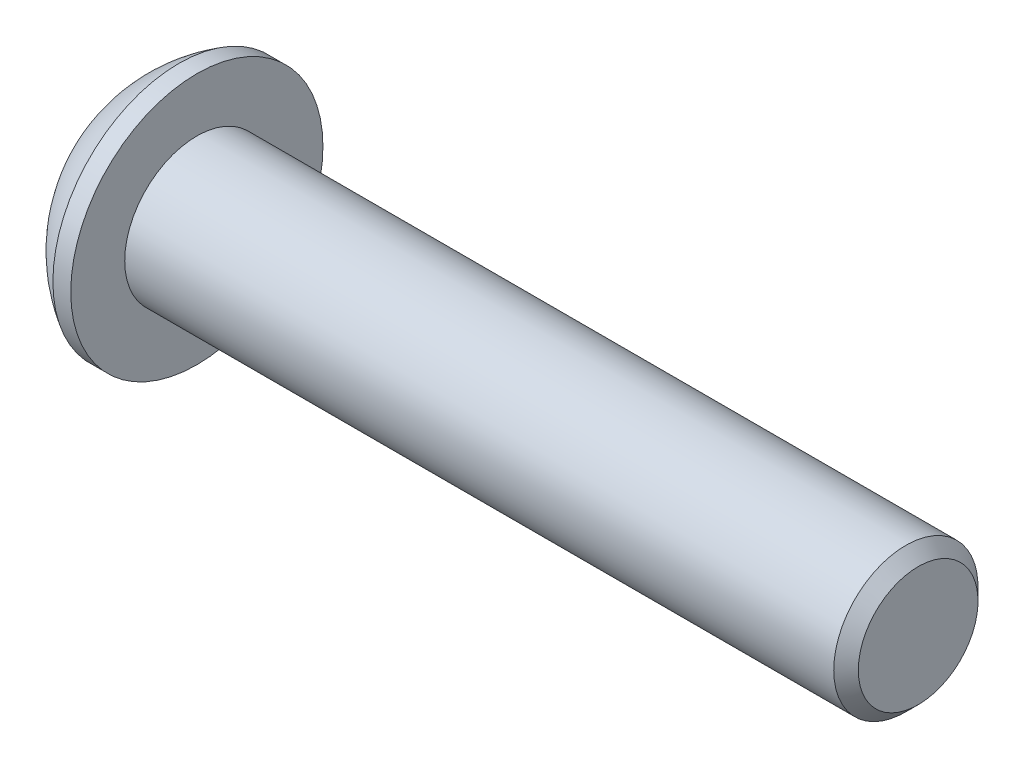
ISO-10303-21;
HEADER;
FILE_DESCRIPTION(('STEP AP214'),'2;1');
FILE_NAME('part.step','',(''),(''),'','','');
FILE_SCHEMA(('AUTOMOTIVE_DESIGN { 1 0 10303 214 1 1 1 1 }'));
ENDSEC;
DATA;
#1=APPLICATION_CONTEXT('core data for automotive mechanical design processes');
#2=APPLICATION_PROTOCOL_DEFINITION('international standard','automotive_design',2000,#1);
#3=PRODUCT_CONTEXT('',#1,'mechanical');
#4=PRODUCT('Part','Part','',(#3));
#5=PRODUCT_RELATED_PRODUCT_CATEGORY('part','',(#4));
#6=PRODUCT_DEFINITION_FORMATION('','',#4);
#7=PRODUCT_DEFINITION_CONTEXT('part definition',#1,'design');
#8=PRODUCT_DEFINITION('design','',#6,#7);
#9=PRODUCT_DEFINITION_SHAPE('','',#8);
#10=(LENGTH_UNIT() NAMED_UNIT(*) SI_UNIT(.MILLI.,.METRE.));
#11=(NAMED_UNIT(*) PLANE_ANGLE_UNIT() SI_UNIT($,.RADIAN.));
#12=(NAMED_UNIT(*) SI_UNIT($,.STERADIAN.) SOLID_ANGLE_UNIT());
#13=UNCERTAINTY_MEASURE_WITH_UNIT(LENGTH_MEASURE(1.E-05),#10,'distance_accuracy_value','');
#14=(GEOMETRIC_REPRESENTATION_CONTEXT(3) GLOBAL_UNCERTAINTY_ASSIGNED_CONTEXT((#13)) GLOBAL_UNIT_ASSIGNED_CONTEXT((#10,
#11,#12)) REPRESENTATION_CONTEXT('',''));
#15=CARTESIAN_POINT('',(0.,0.,0.));
#16=DIRECTION('',(0.,0.,1.));
#17=DIRECTION('',(1.,0.,0.));
#18=AXIS2_PLACEMENT_3D('',#15,#16,#17);
#19=CARTESIAN_POINT('',(0.,0.,0.));
#20=DIRECTION('',(-1.,0.,0.));
#21=DIRECTION('',(0.,0.,1.));
#22=AXIS2_PLACEMENT_3D('',#19,#20,#21);
#23=PLANE('',#22);
#24=CARTESIAN_POINT('',(0.,0.,0.));
#25=DIRECTION('',(-1.,0.,0.));
#26=DIRECTION('',(0.,0.,1.));
#27=AXIS2_PLACEMENT_3D('',#24,#25,#26);
#28=CIRCLE('',#27,2.77495);
#29=CARTESIAN_POINT('',(0.,2.77495,0.));
#30=VERTEX_POINT('',#29);
#31=EDGE_CURVE('E11',#30,#30,#28,.T.);
#32=ORIENTED_EDGE('',*,*,#31,.T.);
#33=EDGE_LOOP('',(#32));
#34=FACE_BOUND('',#33,.T.);
#35=DIRECTION('',(0.,-1.,0.));
#36=VECTOR('',#35,1.);
#37=CARTESIAN_POINT('',(0.,-1.14384635331849,1.9812));
#38=LINE('',#37,#36);
#39=CARTESIAN_POINT('',(0.,1.14384635331849,1.9812));
#40=VERTEX_POINT('',#39);
#41=CARTESIAN_POINT('',(0.,-1.14384635331849,1.9812));
#42=VERTEX_POINT('',#41);
#43=EDGE_CURVE('E46',#40,#42,#38,.T.);
#44=ORIENTED_EDGE('',*,*,#43,.T.);
#45=DIRECTION('',(0.,-0.5,-0.866025403784439));
#46=VECTOR('',#45,1.);
#47=CARTESIAN_POINT('',(0.,-2.28769270663697,0.));
#48=LINE('',#47,#46);
#49=CARTESIAN_POINT('',(0.,-2.28769270663697,0.));
#50=VERTEX_POINT('',#49);
#51=EDGE_CURVE('E362',#42,#50,#48,.T.);
#52=ORIENTED_EDGE('',*,*,#51,.T.);
#53=DIRECTION('',(0.,0.5,-0.866025403784439));
#54=VECTOR('',#53,1.);
#55=CARTESIAN_POINT('',(0.,-1.14384635331849,-1.9812));
#56=LINE('',#55,#54);
#57=CARTESIAN_POINT('',(0.,-1.14384635331849,-1.9812));
#58=VERTEX_POINT('',#57);
#59=EDGE_CURVE('E126',#50,#58,#56,.T.);
#60=ORIENTED_EDGE('',*,*,#59,.T.);
#61=DIRECTION('',(0.,1.,0.));
#62=VECTOR('',#61,1.);
#63=CARTESIAN_POINT('',(0.,1.14384635331849,-1.9812));
#64=LINE('',#63,#62);
#65=CARTESIAN_POINT('',(0.,1.14384635331849,-1.9812));
#66=VERTEX_POINT('',#65);
#67=EDGE_CURVE('E365',#58,#66,#64,.T.);
#68=ORIENTED_EDGE('',*,*,#67,.T.);
#69=DIRECTION('',(0.,0.5,0.866025403784439));
#70=VECTOR('',#69,1.);
#71=CARTESIAN_POINT('',(0.,2.28769270663697,0.));
#72=LINE('',#71,#70);
#73=CARTESIAN_POINT('',(0.,2.28769270663697,0.));
#74=VERTEX_POINT('',#73);
#75=EDGE_CURVE('E367',#66,#74,#72,.T.);
#76=ORIENTED_EDGE('',*,*,#75,.T.);
#77=DIRECTION('',(0.,-0.5,0.866025403784439));
#78=VECTOR('',#77,1.);
#79=CARTESIAN_POINT('',(0.,1.14384635331849,1.9812));
#80=LINE('',#79,#78);
#81=EDGE_CURVE('E369',#74,#40,#80,.T.);
#82=ORIENTED_EDGE('',*,*,#81,.T.);
#83=EDGE_LOOP('',(#44,#52,#60,#68,#76,#82));
#84=FACE_BOUND('',#83,.T.);
#85=ADVANCED_FACE('F32',(#34,#84),#23,.T.);
#86=CARTESIAN_POINT('',(5.78512506188119,0.,0.));
#87=DIRECTION('',(-1.,0.,0.));
#88=DIRECTION('',(0.,1.,0.));
#89=AXIS2_PLACEMENT_3D('',#86,#87,#88);
#90=SPHERICAL_SURFACE('',#89,6.41623094067739);
#91=CARTESIAN_POINT('',(2.5654,0.,0.));
#92=DIRECTION('',(-1.,0.,0.));
#93=DIRECTION('',(0.,0.,1.));
#94=AXIS2_PLACEMENT_3D('',#91,#92,#93);
#95=CIRCLE('',#94,5.5499);
#96=CARTESIAN_POINT('',(2.5654,5.5499,0.));
#97=VERTEX_POINT('',#96);
#98=EDGE_CURVE('E39',#97,#97,#95,.T.);
#99=CARTESIAN_POINT('',(2.5654,5.5499,0.));
#100=CARTESIAN_POINT('',(2.53083708566419,5.52984868712258,0.));
#101=CARTESIAN_POINT('',(2.49646152825914,5.50947442663449,0.));
#102=CARTESIAN_POINT('',(2.42809701945272,5.4680872977392,0.));
#103=CARTESIAN_POINT('',(2.39410806805135,5.447074429332,0.));
#104=CARTESIAN_POINT('',(2.32652866339446,5.40441737190071,0.));
#105=CARTESIAN_POINT('',(2.29293821013895,5.38277318287661,0.));
#106=CARTESIAN_POINT('',(2.22616751866502,5.33886105159856,0.));
#107=CARTESIAN_POINT('',(2.19298728044662,5.3165931093446,0.));
#108=CARTESIAN_POINT('',(2.12704860244366,5.27144124070729,0.));
#109=CARTESIAN_POINT('',(2.09429016265912,5.24855731432393,0.));
#110=CARTESIAN_POINT('',(2.02920651509859,5.20218146582175,0.));
#111=CARTESIAN_POINT('',(1.99688130732261,5.17868954370292,0.));
#112=CARTESIAN_POINT('',(1.93267540683267,5.13110590319174,0.));
#113=CARTESIAN_POINT('',(1.90079471411871,5.10701418479938,0.));
#114=CARTESIAN_POINT('',(1.83748897146475,5.05823936086598,0.));
#115=CARTESIAN_POINT('',(1.80606392152475,5.03355625532495,0.));
#116=CARTESIAN_POINT('',(1.74368043314138,4.98360727255644,0.));
#117=CARTESIAN_POINT('',(1.71272199469802,4.95834139532897,0.));
#118=CARTESIAN_POINT('',(1.65128253514951,4.90723568808467,0.));
#119=CARTESIAN_POINT('',(1.62080151404435,4.88139585806785,0.));
#120=CARTESIAN_POINT('',(1.56032752837792,4.82915126447052,0.));
#121=CARTESIAN_POINT('',(1.53033456381665,4.80274650089003,0.));
#122=CARTESIAN_POINT('',(1.4708471600897,4.74938125657909,0.));
#123=CARTESIAN_POINT('',(1.44135272092403,4.72242077584864,0.));
#124=CARTESIAN_POINT('',(1.38287266283316,4.66795350762059,0.));
#125=CARTESIAN_POINT('',(1.35388704390797,4.64044672012299,0.));
#126=CARTESIAN_POINT('',(1.29643474354244,4.58489643942841,0.));
#127=CARTESIAN_POINT('',(1.26796806210209,4.55685294623144,0.));
#128=CARTESIAN_POINT('',(1.21156357281885,4.50023904253955,0.));
#129=CARTESIAN_POINT('',(1.18362576497595,4.47166863204464,0.));
#130=CARTESIAN_POINT('',(1.12828877440023,4.41401086607543,0.));
#131=CARTESIAN_POINT('',(1.10088959166741,4.38492351060113,0.));
#132=CARTESIAN_POINT('',(1.04663941482087,4.32624200742801,0.));
#133=CARTESIAN_POINT('',(1.01978842070714,4.2966478597292,0.));
#134=CARTESIAN_POINT('',(0.966643993266069,4.2369631017545,0.));
#135=CARTESIAN_POINT('',(0.94035055993872,4.20687249147862,0.));
#136=CARTESIAN_POINT('',(0.888330431624668,4.14620531128432,0.));
#137=CARTESIAN_POINT('',(0.862603736637966,4.11562874136591,0.));
#138=CARTESIAN_POINT('',(0.811726064743087,4.05400031444217,0.));
#139=CARTESIAN_POINT('',(0.786575087834911,4.02294845743684,0.));
#140=CARTESIAN_POINT('',(0.736857630884291,3.96038029479081,0.));
#141=CARTESIAN_POINT('',(0.712291150841848,3.9288639891501,0.));
#142=CARTESIAN_POINT('',(0.6637512623949,3.8653779297977,0.));
#143=CARTESIAN_POINT('',(0.639777853990396,3.833408176086,0.));
#144=CARTESIAN_POINT('',(0.592432476584127,3.76902637942894,0.));
#145=CARTESIAN_POINT('',(0.569060507582362,3.73661433648358,0.));
#146=CARTESIAN_POINT('',(0.522926166816147,3.67135927457555,0.));
#147=CARTESIAN_POINT('',(0.500163795051696,3.63851625561289,0.));
#148=CARTESIAN_POINT('',(0.455256593824864,3.57241070531295,0.));
#149=CARTESIAN_POINT('',(0.433111764362482,3.53914817397566,0.));
#150=CARTESIAN_POINT('',(0.389447377232278,3.47221520900886,0.));
#151=CARTESIAN_POINT('',(0.367927819564456,3.43854477537934,0.));
#152=CARTESIAN_POINT('',(0.325521487354906,3.37080775824281,0.));
#153=CARTESIAN_POINT('',(0.304634712813178,3.3367411747358,0.));
#154=CARTESIAN_POINT('',(0.263501236996927,3.26822374869429,0.));
#155=CARTESIAN_POINT('',(0.243254535722403,3.23377290615979,0.));
#156=CARTESIAN_POINT('',(0.203408274368182,3.16449898643303,0.));
#157=CARTESIAN_POINT('',(0.183808714288484,3.12967590924077,0.));
#158=CARTESIAN_POINT('',(0.14526357289266,3.05966967674634,0.));
#159=CARTESIAN_POINT('',(0.126317991576534,3.02448652144419,0.));
#160=CARTESIAN_POINT('',(0.089087433723099,2.95377240655615,0.));
#161=CARTESIAN_POINT('',(0.0708024571857911,2.91824144697028,0.));
#162=CARTESIAN_POINT('',(0.0348994419493881,2.84684415010637,0.));
#163=CARTESIAN_POINT('',(0.017281403250293,2.81097781282834,0.));
#164=CARTESIAN_POINT('',(0.,2.77495,0.));
#165=B_SPLINE_CURVE_WITH_KNOTS('',3,(#99,#100,#101,#102,#103,#104,#105,#106,#107,#108,#109,#110,
#111,#112,#113,#114,#115,#116,#117,#118,#119,#120,#121,#122,#123,#124,#125,#126,#127,#128,#129,
#130,#131,#132,#133,#134,#135,#136,#137,#138,#139,#140,#141,#142,#143,#144,#145,#146,#147,#148,
#149,#150,#151,#152,#153,#154,#155,#156,#157,#158,#159,#160,#161,#162,#163,#164),.UNSPECIFIED.,
.F.,.F.,(4,2,2,2,2,2,2,2,2,2,2,2,2,2,2,2,2,2,2,2,2,2,2,2,2,2,2,2,2,2,2,2,4),(0.,
0.119872570538484,0.239745141076968,0.359617711615453,0.479490282153937,0.599362852692421,
0.719235423230905,0.83910799376939,0.958980564307873,1.07885313484636,1.19872570538484,
1.31859827592333,1.43847084646181,1.55834341700029,1.67821598753878,1.79808855807726,
1.91796112861575,2.03783369915423,2.15770626969271,2.2775788402312,2.39745141076968,
2.51732398130817,2.63719655184665,2.75706912238513,2.87694169292362,2.9968142634621,
3.11668683400059,3.23655940453907,3.35643197507756,3.47630454561604,3.59617711615452,
3.71604968669301,3.83592225723149),.UNSPECIFIED.);
#166=EDGE_CURVE('BSEAM153',#97,#30,#165,.T.);
#167=ORIENTED_EDGE('',*,*,#98,.T.);
#168=ORIENTED_EDGE('',*,*,#31,.F.);
#169=ORIENTED_EDGE('',*,*,#166,.T.);
#170=ORIENTED_EDGE('',*,*,#166,.F.);
#171=EDGE_LOOP('',(#167,#169,#168,#170));
#172=FACE_BOUND('',#171,.T.);
#173=ADVANCED_FACE('F153',(#172),#90,.T.);
#174=CARTESIAN_POINT('',(0.,0.,0.));
#175=DIRECTION('',(-1.,0.,0.));
#176=DIRECTION('',(0.,0.,1.));
#177=AXIS2_PLACEMENT_3D('',#174,#175,#176);
#178=CYLINDRICAL_SURFACE('',#177,5.5499);
#179=ORIENTED_EDGE('',*,*,#98,.F.);
#180=EDGE_LOOP('',(#179));
#181=FACE_BOUND('',#180,.T.);
#182=CARTESIAN_POINT('',(3.3528,0.,0.));
#183=DIRECTION('',(-1.,0.,0.));
#184=DIRECTION('',(0.,0.,1.));
#185=AXIS2_PLACEMENT_3D('',#182,#183,#184);
#186=CIRCLE('',#185,5.5499);
#187=CARTESIAN_POINT('',(3.3528,0.,5.5499));
#188=VERTEX_POINT('',#187);
#189=EDGE_CURVE('E148',#188,#188,#186,.T.);
#190=ORIENTED_EDGE('',*,*,#189,.T.);
#191=EDGE_LOOP('',(#190));
#192=FACE_BOUND('',#191,.T.);
#193=ADVANCED_FACE('F156',(#181,#192),#178,.T.);
#194=CARTESIAN_POINT('',(3.3528,3.17499999999999,0.));
#195=DIRECTION('',(-1.,0.,0.));
#196=DIRECTION('',(0.,0.,1.));
#197=AXIS2_PLACEMENT_3D('',#194,#195,#196);
#198=PLANE('',#197);
#199=ORIENTED_EDGE('',*,*,#189,.F.);
#200=EDGE_LOOP('',(#199));
#201=FACE_BOUND('',#200,.T.);
#202=CARTESIAN_POINT('',(3.3528,0.,0.));
#203=DIRECTION('',(-1.,0.,0.));
#204=DIRECTION('',(0.,0.,1.));
#205=AXIS2_PLACEMENT_3D('',#202,#203,#204);
#206=CIRCLE('',#205,3.17499999999999);
#207=CARTESIAN_POINT('',(3.3528,0.,3.17499999999999));
#208=VERTEX_POINT('',#207);
#209=EDGE_CURVE('E145',#208,#208,#206,.T.);
#210=ORIENTED_EDGE('',*,*,#209,.T.);
#211=EDGE_LOOP('',(#210));
#212=FACE_BOUND('',#211,.T.);
#213=ADVANCED_FACE('F159',(#201,#212),#198,.F.);
#214=CARTESIAN_POINT('',(0.,0.,0.));
#215=DIRECTION('',(-1.,0.,0.));
#216=DIRECTION('',(0.,0.,1.));
#217=AXIS2_PLACEMENT_3D('',#214,#215,#216);
#218=CYLINDRICAL_SURFACE('',#217,3.175);
#219=ORIENTED_EDGE('',*,*,#209,.F.);
#220=EDGE_LOOP('',(#219));
#221=FACE_BOUND('',#220,.T.);
#222=CARTESIAN_POINT('',(34.56178,0.,0.));
#223=DIRECTION('',(-1.,0.,0.));
#224=DIRECTION('',(0.,0.,1.));
#225=AXIS2_PLACEMENT_3D('',#222,#223,#224);
#226=CIRCLE('',#225,3.175);
#227=CARTESIAN_POINT('',(34.56178,0.,3.175));
#228=VERTEX_POINT('',#227);
#229=EDGE_CURVE('E142',#228,#228,#226,.T.);
#230=ORIENTED_EDGE('',*,*,#229,.T.);
#231=EDGE_LOOP('',(#230));
#232=FACE_BOUND('',#231,.T.);
#233=ADVANCED_FACE('F165',(#221,#232),#218,.T.);
#234=CARTESIAN_POINT('',(35.1028,0.,0.));
#235=DIRECTION('',(-1.,0.,0.));
#236=DIRECTION('',(0.,0.,1.));
#237=AXIS2_PLACEMENT_3D('',#234,#235,#236);
#238=CONICAL_SURFACE('',#237,2.63398,0.785398163397451);
#239=ORIENTED_EDGE('',*,*,#229,.F.);
#240=EDGE_LOOP('',(#239));
#241=FACE_BOUND('',#240,.T.);
#242=CARTESIAN_POINT('',(35.1028,0.,0.));
#243=DIRECTION('',(-1.,0.,0.));
#244=DIRECTION('',(0.,0.,1.));
#245=AXIS2_PLACEMENT_3D('',#242,#243,#244);
#246=CIRCLE('',#245,2.63398);
#247=CARTESIAN_POINT('',(35.1028,0.,2.63398));
#248=VERTEX_POINT('',#247);
#249=EDGE_CURVE('E138',#248,#248,#246,.T.);
#250=ORIENTED_EDGE('',*,*,#249,.T.);
#251=EDGE_LOOP('',(#250));
#252=FACE_BOUND('',#251,.T.);
#253=ADVANCED_FACE('F171',(#241,#252),#238,.T.);
#254=CARTESIAN_POINT('',(35.1028,0.,0.));
#255=DIRECTION('',(-1.,0.,0.));
#256=DIRECTION('',(0.,0.,1.));
#257=AXIS2_PLACEMENT_3D('',#254,#255,#256);
#258=PLANE('',#257);
#259=ORIENTED_EDGE('',*,*,#249,.F.);
#260=EDGE_LOOP('',(#259));
#261=FACE_BOUND('',#260,.T.);
#262=ADVANCED_FACE('F177',(#261),#258,.F.);
#263=CARTESIAN_POINT('',(2.2098,-2.28769270663697,0.));
#264=DIRECTION('',(0.,0.866025403784439,-0.5));
#265=DIRECTION('',(0.,0.5,0.866025403784439));
#266=AXIS2_PLACEMENT_3D('',#263,#264,#265);
#267=PLANE('',#266);
#268=DIRECTION('',(0.,-0.5,-0.866025403784439));
#269=VECTOR('',#268,1.);
#270=CARTESIAN_POINT('',(2.2098,-2.28769270663697,0.));
#271=LINE('',#270,#269);
#272=CARTESIAN_POINT('',(2.2098,-1.14384635331849,1.9812));
#273=VERTEX_POINT('',#272);
#274=CARTESIAN_POINT('',(2.2098,-1.71576952997773,0.9906));
#275=VERTEX_POINT('',#274);
#276=EDGE_CURVE('E112',#273,#275,#271,.T.);
#277=ORIENTED_EDGE('',*,*,#276,.T.);
#278=CARTESIAN_POINT('',(2.2098,-2.28769270663697,0.));
#279=VERTEX_POINT('',#278);
#280=EDGE_CURVE('E107',#275,#279,#271,.T.);
#281=ORIENTED_EDGE('',*,*,#280,.T.);
#282=DIRECTION('',(-1.,0.,0.));
#283=VECTOR('',#282,1.);
#284=CARTESIAN_POINT('',(2.2098,-2.28769270663697,0.));
#285=LINE('',#284,#283);
#286=EDGE_CURVE('E109',#279,#50,#285,.T.);
#287=ORIENTED_EDGE('',*,*,#286,.T.);
#288=ORIENTED_EDGE('',*,*,#51,.F.);
#289=DIRECTION('',(-1.,0.,0.));
#290=VECTOR('',#289,1.);
#291=CARTESIAN_POINT('',(2.2098,-1.14384635331849,1.9812));
#292=LINE('',#291,#290);
#293=EDGE_CURVE('E357',#273,#42,#292,.T.);
#294=ORIENTED_EDGE('',*,*,#293,.F.);
#295=EDGE_LOOP('',(#277,#281,#287,#288,#294));
#296=FACE_BOUND('',#295,.T.);
#297=ADVANCED_FACE('F108',(#296),#267,.T.);
#298=CARTESIAN_POINT('',(2.2098,-1.14384635331849,-1.9812));
#299=DIRECTION('',(0.,0.866025403784439,0.5));
#300=DIRECTION('',(0.,-0.5,0.866025403784439));
#301=AXIS2_PLACEMENT_3D('',#298,#299,#300);
#302=PLANE('',#301);
#303=DIRECTION('',(0.,0.5,-0.866025403784439));
#304=VECTOR('',#303,1.);
#305=CARTESIAN_POINT('',(2.2098,-1.14384635331849,-1.9812));
#306=LINE('',#305,#304);
#307=CARTESIAN_POINT('',(2.2098,-1.71576952997773,-0.9906));
#308=VERTEX_POINT('',#307);
#309=EDGE_CURVE('E54',#279,#308,#306,.T.);
#310=ORIENTED_EDGE('',*,*,#309,.T.);
#311=CARTESIAN_POINT('',(2.2098,-1.14384635331849,-1.9812));
#312=VERTEX_POINT('',#311);
#313=EDGE_CURVE('E121',#308,#312,#306,.T.);
#314=ORIENTED_EDGE('',*,*,#313,.T.);
#315=DIRECTION('',(-1.,0.,0.));
#316=VECTOR('',#315,1.);
#317=CARTESIAN_POINT('',(2.2098,-1.14384635331849,-1.9812));
#318=LINE('',#317,#316);
#319=EDGE_CURVE('E128',#312,#58,#318,.T.);
#320=ORIENTED_EDGE('',*,*,#319,.T.);
#321=ORIENTED_EDGE('',*,*,#59,.F.);
#322=ORIENTED_EDGE('',*,*,#286,.F.);
#323=EDGE_LOOP('',(#310,#314,#320,#321,#322));
#324=FACE_BOUND('',#323,.T.);
#325=ADVANCED_FACE('F124',(#324),#302,.T.);
#326=CARTESIAN_POINT('',(2.2098,1.14384635331849,-1.9812));
#327=DIRECTION('',(0.,0.,1.));
#328=DIRECTION('',(1.,0.,0.));
#329=AXIS2_PLACEMENT_3D('',#326,#327,#328);
#330=PLANE('',#329);
#331=DIRECTION('',(0.,1.,0.));
#332=VECTOR('',#331,1.);
#333=CARTESIAN_POINT('',(2.2098,1.14384635331849,-1.9812));
#334=LINE('',#333,#332);
#335=CARTESIAN_POINT('',(2.2098,0.,-1.9812));
#336=VERTEX_POINT('',#335);
#337=EDGE_CURVE('E387',#312,#336,#334,.T.);
#338=ORIENTED_EDGE('',*,*,#337,.T.);
#339=CARTESIAN_POINT('',(2.2098,1.14384635331849,-1.9812));
#340=VERTEX_POINT('',#339);
#341=EDGE_CURVE('E120',#336,#340,#334,.T.);
#342=ORIENTED_EDGE('',*,*,#341,.T.);
#343=DIRECTION('',(-1.,0.,0.));
#344=VECTOR('',#343,1.);
#345=CARTESIAN_POINT('',(2.2098,1.14384635331849,-1.9812));
#346=LINE('',#345,#344);
#347=EDGE_CURVE('E133',#340,#66,#346,.T.);
#348=ORIENTED_EDGE('',*,*,#347,.T.);
#349=ORIENTED_EDGE('',*,*,#67,.F.);
#350=ORIENTED_EDGE('',*,*,#319,.F.);
#351=EDGE_LOOP('',(#338,#342,#348,#349,#350));
#352=FACE_BOUND('',#351,.T.);
#353=ADVANCED_FACE('F236',(#352),#330,.T.);
#354=CARTESIAN_POINT('',(2.2098,2.28769270663697,0.));
#355=DIRECTION('',(0.,-0.866025403784439,0.5));
#356=DIRECTION('',(0.,-0.5,-0.866025403784439));
#357=AXIS2_PLACEMENT_3D('',#354,#355,#356);
#358=PLANE('',#357);
#359=DIRECTION('',(0.,0.5,0.866025403784439));
#360=VECTOR('',#359,1.);
#361=CARTESIAN_POINT('',(2.2098,2.28769270663697,0.));
#362=LINE('',#361,#360);
#363=CARTESIAN_POINT('',(2.2098,1.71576952997773,-0.990600000000001));
#364=VERTEX_POINT('',#363);
#365=EDGE_CURVE('E391',#340,#364,#362,.T.);
#366=ORIENTED_EDGE('',*,*,#365,.T.);
#367=CARTESIAN_POINT('',(2.2098,2.28769270663697,0.));
#368=VERTEX_POINT('',#367);
#369=EDGE_CURVE('E389',#364,#368,#362,.T.);
#370=ORIENTED_EDGE('',*,*,#369,.T.);
#371=DIRECTION('',(-1.,0.,0.));
#372=VECTOR('',#371,1.);
#373=CARTESIAN_POINT('',(2.2098,2.28769270663697,0.));
#374=LINE('',#373,#372);
#375=EDGE_CURVE('E373',#368,#74,#374,.T.);
#376=ORIENTED_EDGE('',*,*,#375,.T.);
#377=ORIENTED_EDGE('',*,*,#75,.F.);
#378=ORIENTED_EDGE('',*,*,#347,.F.);
#379=EDGE_LOOP('',(#366,#370,#376,#377,#378));
#380=FACE_BOUND('',#379,.T.);
#381=ADVANCED_FACE('F245',(#380),#358,.T.);
#382=CARTESIAN_POINT('',(2.2098,1.14384635331849,1.9812));
#383=DIRECTION('',(0.,-0.866025403784439,-0.5));
#384=DIRECTION('',(0.,0.5,-0.866025403784439));
#385=AXIS2_PLACEMENT_3D('',#382,#383,#384);
#386=PLANE('',#385);
#387=DIRECTION('',(0.,-0.5,0.866025403784439));
#388=VECTOR('',#387,1.);
#389=CARTESIAN_POINT('',(2.2098,1.14384635331849,1.9812));
#390=LINE('',#389,#388);
#391=CARTESIAN_POINT('',(2.2098,1.71576952997773,0.990600000000001));
#392=VERTEX_POINT('',#391);
#393=EDGE_CURVE('E352',#368,#392,#390,.T.);
#394=ORIENTED_EDGE('',*,*,#393,.T.);
#395=CARTESIAN_POINT('',(2.2098,1.14384635331849,1.9812));
#396=VERTEX_POINT('',#395);
#397=EDGE_CURVE('E348',#392,#396,#390,.T.);
#398=ORIENTED_EDGE('',*,*,#397,.T.);
#399=DIRECTION('',(-1.,0.,0.));
#400=VECTOR('',#399,1.);
#401=CARTESIAN_POINT('',(2.2098,1.14384635331849,1.9812));
#402=LINE('',#401,#400);
#403=EDGE_CURVE('E356',#396,#40,#402,.T.);
#404=ORIENTED_EDGE('',*,*,#403,.T.);
#405=ORIENTED_EDGE('',*,*,#81,.F.);
#406=ORIENTED_EDGE('',*,*,#375,.F.);
#407=EDGE_LOOP('',(#394,#398,#404,#405,#406));
#408=FACE_BOUND('',#407,.T.);
#409=ADVANCED_FACE('F255',(#408),#386,.T.);
#410=CARTESIAN_POINT('',(2.2098,-1.14384635331849,1.9812));
#411=DIRECTION('',(0.,0.,-1.));
#412=DIRECTION('',(0.,1.,0.));
#413=AXIS2_PLACEMENT_3D('',#410,#411,#412);
#414=PLANE('',#413);
#415=DIRECTION('',(0.,-1.,0.));
#416=VECTOR('',#415,1.);
#417=CARTESIAN_POINT('',(2.2098,-1.14384635331849,1.9812));
#418=LINE('',#417,#416);
#419=CARTESIAN_POINT('',(2.2098,0.,1.9812));
#420=VERTEX_POINT('',#419);
#421=EDGE_CURVE('E347',#396,#420,#418,.T.);
#422=ORIENTED_EDGE('',*,*,#421,.T.);
#423=EDGE_CURVE('E350',#420,#273,#418,.T.);
#424=ORIENTED_EDGE('',*,*,#423,.T.);
#425=ORIENTED_EDGE('',*,*,#293,.T.);
#426=ORIENTED_EDGE('',*,*,#43,.F.);
#427=ORIENTED_EDGE('',*,*,#403,.F.);
#428=EDGE_LOOP('',(#422,#424,#425,#426,#427));
#429=FACE_BOUND('',#428,.T.);
#430=ADVANCED_FACE('F265',(#429),#414,.T.);
#431=CARTESIAN_POINT('',(2.2098,-2.28769270663697,0.));
#432=DIRECTION('',(1.,0.,0.));
#433=DIRECTION('',(0.,0.,-1.));
#434=AXIS2_PLACEMENT_3D('',#431,#432,#433);
#435=PLANE('',#434);
#436=CARTESIAN_POINT('',(2.2098,0.,0.));
#437=DIRECTION('',(-1.,0.,0.));
#438=DIRECTION('',(0.,0.,1.));
#439=AXIS2_PLACEMENT_3D('',#436,#437,#438);
#440=CIRCLE('',#439,1.9812);
#441=EDGE_CURVE('E394',#364,#336,#440,.T.);
#442=ORIENTED_EDGE('',*,*,#441,.F.);
#443=ORIENTED_EDGE('',*,*,#365,.F.);
#444=ORIENTED_EDGE('',*,*,#341,.F.);
#445=EDGE_LOOP('',(#442,#443,#444));
#446=FACE_BOUND('',#445,.T.);
#447=ADVANCED_FACE('F275',(#446),#435,.F.);
#448=EDGE_CURVE('E139',#392,#364,#440,.T.);
#449=ORIENTED_EDGE('',*,*,#448,.F.);
#450=ORIENTED_EDGE('',*,*,#393,.F.);
#451=ORIENTED_EDGE('',*,*,#369,.F.);
#452=EDGE_LOOP('',(#449,#450,#451));
#453=FACE_BOUND('',#452,.T.);
#454=ADVANCED_FACE('F285',(#453),#435,.F.);
#455=EDGE_CURVE('E132',#420,#392,#440,.T.);
#456=ORIENTED_EDGE('',*,*,#455,.F.);
#457=ORIENTED_EDGE('',*,*,#421,.F.);
#458=ORIENTED_EDGE('',*,*,#397,.F.);
#459=EDGE_LOOP('',(#456,#457,#458));
#460=FACE_BOUND('',#459,.T.);
#461=ADVANCED_FACE('F296',(#460),#435,.F.);
#462=EDGE_CURVE('E127',#275,#420,#440,.T.);
#463=ORIENTED_EDGE('',*,*,#462,.F.);
#464=ORIENTED_EDGE('',*,*,#276,.F.);
#465=ORIENTED_EDGE('',*,*,#423,.F.);
#466=EDGE_LOOP('',(#463,#464,#465));
#467=FACE_BOUND('',#466,.T.);
#468=ADVANCED_FACE('F305',(#467),#435,.F.);
#469=EDGE_CURVE('E118',#308,#275,#440,.T.);
#470=ORIENTED_EDGE('',*,*,#469,.F.);
#471=ORIENTED_EDGE('',*,*,#309,.F.);
#472=ORIENTED_EDGE('',*,*,#280,.F.);
#473=EDGE_LOOP('',(#470,#471,#472));
#474=FACE_BOUND('',#473,.T.);
#475=ADVANCED_FACE('F117',(#474),#435,.F.);
#476=EDGE_CURVE('E388',#336,#308,#440,.T.);
#477=ORIENTED_EDGE('',*,*,#476,.F.);
#478=ORIENTED_EDGE('',*,*,#337,.F.);
#479=ORIENTED_EDGE('',*,*,#313,.F.);
#480=EDGE_LOOP('',(#477,#478,#479));
#481=FACE_BOUND('',#480,.T.);
#482=ADVANCED_FACE('F288',(#481),#435,.F.);
#483=CARTESIAN_POINT('',(3.3536463533185,0.,0.));
#484=DIRECTION('',(-1.,0.,0.));
#485=DIRECTION('',(0.,0.,1.));
#486=AXIS2_PLACEMENT_3D('',#483,#484,#485);
#487=CONICAL_SURFACE('',#486,0.,1.04719755119659);
#488=ORIENTED_EDGE('',*,*,#455,.T.);
#489=ORIENTED_EDGE('',*,*,#448,.T.);
#490=ORIENTED_EDGE('',*,*,#441,.T.);
#491=ORIENTED_EDGE('',*,*,#476,.T.);
#492=ORIENTED_EDGE('',*,*,#469,.T.);
#493=ORIENTED_EDGE('',*,*,#462,.T.);
#494=EDGE_LOOP('',(#488,#489,#490,#491,#492,#493));
#495=FACE_BOUND('',#494,.T.);
#496=CARTESIAN_POINT('',(3.3536463533185,0.,0.));
#497=VERTEX_POINT('',#496);
#498=VERTEX_LOOP('',#497);
#499=FACE_BOUND('',#498,.T.);
#500=ADVANCED_FACE('F329',(#495,#499),#487,.F.);
#501=CLOSED_SHELL('',(#85,#173,#193,#213,#233,#253,#262,#297,#325,#353,#381,#409,#430,#447,#454,
#461,#468,#475,#482,#500));
#502=MANIFOLD_SOLID_BREP('B2',#501);
#503=ADVANCED_BREP_SHAPE_REPRESENTATION('',(#18,#502),#14);
#504=SHAPE_DEFINITION_REPRESENTATION(#9,#503);
ENDSEC;
END-ISO-10303-21;
